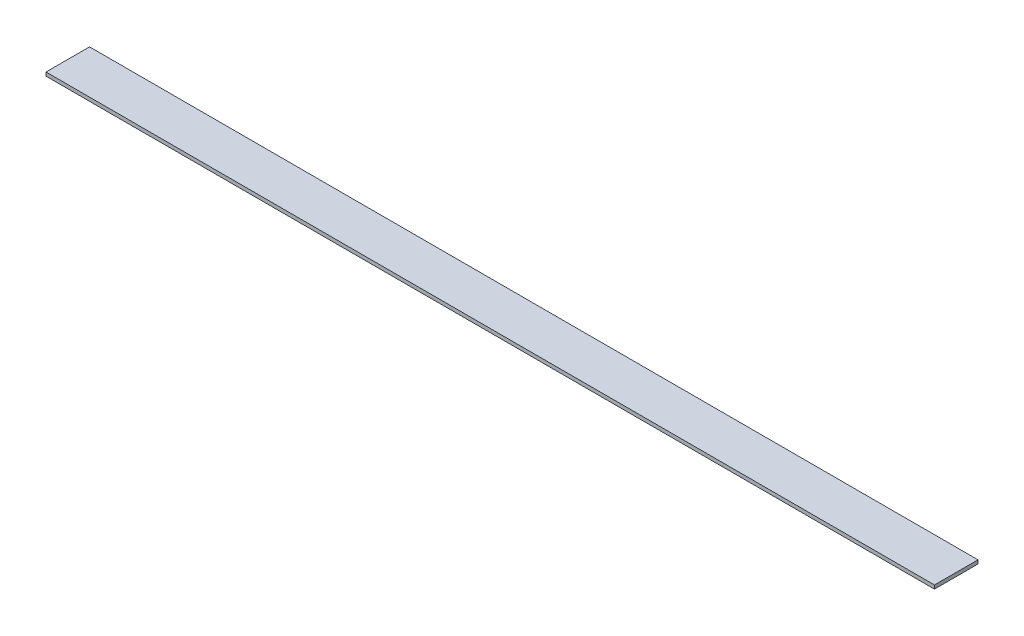
ISO-10303-21;
HEADER;
FILE_DESCRIPTION(('STEP AP214'),'2;1');
FILE_NAME('part.step','',(''),(''),'','','');
FILE_SCHEMA(('AUTOMOTIVE_DESIGN { 1 0 10303 214 1 1 1 1 }'));
ENDSEC;
DATA;
#1=APPLICATION_CONTEXT('core data for automotive mechanical design processes');
#2=APPLICATION_PROTOCOL_DEFINITION('international standard','automotive_design',2000,#1);
#3=PRODUCT_CONTEXT('',#1,'mechanical');
#4=PRODUCT('Part','Part','',(#3));
#5=PRODUCT_RELATED_PRODUCT_CATEGORY('part','',(#4));
#6=PRODUCT_DEFINITION_FORMATION('','',#4);
#7=PRODUCT_DEFINITION_CONTEXT('part definition',#1,'design');
#8=PRODUCT_DEFINITION('design','',#6,#7);
#9=PRODUCT_DEFINITION_SHAPE('','',#8);
#10=(LENGTH_UNIT() NAMED_UNIT(*) SI_UNIT(.MILLI.,.METRE.));
#11=(NAMED_UNIT(*) PLANE_ANGLE_UNIT() SI_UNIT($,.RADIAN.));
#12=(NAMED_UNIT(*) SI_UNIT($,.STERADIAN.) SOLID_ANGLE_UNIT());
#13=UNCERTAINTY_MEASURE_WITH_UNIT(LENGTH_MEASURE(1.E-05),#10,'distance_accuracy_value','');
#14=(GEOMETRIC_REPRESENTATION_CONTEXT(3) GLOBAL_UNCERTAINTY_ASSIGNED_CONTEXT((#13)) GLOBAL_UNIT_ASSIGNED_CONTEXT((#10,
#11,#12)) REPRESENTATION_CONTEXT('',''));
#15=CARTESIAN_POINT('',(0.,0.,0.));
#16=DIRECTION('',(0.,0.,1.));
#17=DIRECTION('',(1.,0.,0.));
#18=AXIS2_PLACEMENT_3D('',#15,#16,#17);
#19=CARTESIAN_POINT('',(0.,3.175,0.));
#20=DIRECTION('',(0.,-1.,0.));
#21=DIRECTION('',(0.,0.,-1.));
#22=AXIS2_PLACEMENT_3D('',#19,#20,#21);
#23=PLANE('',#22);
#24=DIRECTION('',(-1.,0.,0.));
#25=VECTOR('',#24,1.);
#26=CARTESIAN_POINT('',(465.,3.175,-277.5));
#27=LINE('',#26,#25);
#28=CARTESIAN_POINT('',(388.8,3.175,-277.5));
#29=VERTEX_POINT('',#28);
#30=CARTESIAN_POINT('',(-388.8,3.175,-277.5));
#31=VERTEX_POINT('',#30);
#32=EDGE_CURVE('E11',#29,#31,#27,.T.);
#33=ORIENTED_EDGE('',*,*,#32,.T.);
#34=DIRECTION('',(0.,0.,1.));
#35=VECTOR('',#34,1.);
#36=CARTESIAN_POINT('',(-388.8,3.175,1.67016719665026E-13));
#37=LINE('',#36,#35);
#38=CARTESIAN_POINT('',(-388.8,3.175,-239.4));
#39=VERTEX_POINT('',#38);
#40=EDGE_CURVE('E109',#31,#39,#37,.T.);
#41=ORIENTED_EDGE('',*,*,#40,.T.);
#42=DIRECTION('',(-1.,0.,0.));
#43=VECTOR('',#42,1.);
#44=CARTESIAN_POINT('',(388.8,3.175,-239.4));
#45=LINE('',#44,#43);
#46=CARTESIAN_POINT('',(388.8,3.175,-239.4));
#47=VERTEX_POINT('',#46);
#48=EDGE_CURVE('E103',#47,#39,#45,.T.);
#49=ORIENTED_EDGE('',*,*,#48,.F.);
#50=DIRECTION('',(0.,0.,-1.));
#51=VECTOR('',#50,1.);
#52=CARTESIAN_POINT('',(388.8,3.175,0.));
#53=LINE('',#52,#51);
#54=EDGE_CURVE('E55',#47,#29,#53,.T.);
#55=ORIENTED_EDGE('',*,*,#54,.T.);
#56=EDGE_LOOP('',(#33,#41,#49,#55));
#57=FACE_BOUND('',#56,.T.);
#58=ADVANCED_FACE('F39',(#57),#23,.F.);
#59=CARTESIAN_POINT('',(0.,0.,0.));
#60=DIRECTION('',(0.,-1.,0.));
#61=DIRECTION('',(0.,0.,-1.));
#62=AXIS2_PLACEMENT_3D('',#59,#60,#61);
#63=PLANE('',#62);
#64=DIRECTION('',(0.,0.,-1.));
#65=VECTOR('',#64,1.);
#66=CARTESIAN_POINT('',(-388.8,0.,-277.5));
#67=LINE('',#66,#65);
#68=CARTESIAN_POINT('',(-388.8,0.,-239.4));
#69=VERTEX_POINT('',#68);
#70=CARTESIAN_POINT('',(-388.8,0.,-277.5));
#71=VERTEX_POINT('',#70);
#72=EDGE_CURVE('E63',#69,#71,#67,.T.);
#73=ORIENTED_EDGE('',*,*,#72,.T.);
#74=DIRECTION('',(-1.,0.,0.));
#75=VECTOR('',#74,1.);
#76=CARTESIAN_POINT('',(465.,0.,-277.5));
#77=LINE('',#76,#75);
#78=CARTESIAN_POINT('',(388.8,0.,-277.5));
#79=VERTEX_POINT('',#78);
#80=EDGE_CURVE('E43',#79,#71,#77,.T.);
#81=ORIENTED_EDGE('',*,*,#80,.F.);
#82=DIRECTION('',(0.,0.,1.));
#83=VECTOR('',#82,1.);
#84=CARTESIAN_POINT('',(388.8,0.,-277.5));
#85=LINE('',#84,#83);
#86=CARTESIAN_POINT('',(388.8,0.,-239.4));
#87=VERTEX_POINT('',#86);
#88=EDGE_CURVE('E79',#79,#87,#85,.T.);
#89=ORIENTED_EDGE('',*,*,#88,.T.);
#90=DIRECTION('',(-1.,0.,0.));
#91=VECTOR('',#90,1.);
#92=CARTESIAN_POINT('',(388.8,0.,-239.4));
#93=LINE('',#92,#91);
#94=EDGE_CURVE('E106',#87,#69,#93,.T.);
#95=ORIENTED_EDGE('',*,*,#94,.T.);
#96=EDGE_LOOP('',(#73,#81,#89,#95));
#97=FACE_BOUND('',#96,.T.);
#98=ADVANCED_FACE('F97',(#97),#63,.T.);
#99=CARTESIAN_POINT('',(465.,3.175,-277.5));
#100=DIRECTION('',(0.,0.,1.));
#101=DIRECTION('',(1.,0.,0.));
#102=AXIS2_PLACEMENT_3D('',#99,#100,#101);
#103=PLANE('',#102);
#104=ORIENTED_EDGE('',*,*,#80,.T.);
#105=DIRECTION('',(0.,1.,0.));
#106=VECTOR('',#105,1.);
#107=CARTESIAN_POINT('',(-388.8,0.,-277.5));
#108=LINE('',#107,#106);
#109=EDGE_CURVE('E95',#71,#31,#108,.T.);
#110=ORIENTED_EDGE('',*,*,#109,.T.);
#111=ORIENTED_EDGE('',*,*,#32,.F.);
#112=DIRECTION('',(0.,1.,0.));
#113=VECTOR('',#112,1.);
#114=CARTESIAN_POINT('',(388.8,0.,-277.5));
#115=LINE('',#114,#113);
#116=EDGE_CURVE('E82',#79,#29,#115,.T.);
#117=ORIENTED_EDGE('',*,*,#116,.F.);
#118=EDGE_LOOP('',(#104,#110,#111,#117));
#119=FACE_BOUND('',#118,.T.);
#120=ADVANCED_FACE('F41',(#119),#103,.F.);
#121=CARTESIAN_POINT('',(388.8,3.175,-239.4));
#122=DIRECTION('',(0.,0.,1.));
#123=DIRECTION('',(1.,0.,0.));
#124=AXIS2_PLACEMENT_3D('',#121,#122,#123);
#125=PLANE('',#124);
#126=ORIENTED_EDGE('',*,*,#94,.F.);
#127=DIRECTION('',(0.,-1.,0.));
#128=VECTOR('',#127,1.);
#129=CARTESIAN_POINT('',(388.8,3.175,-239.4));
#130=LINE('',#129,#128);
#131=EDGE_CURVE('E83',#47,#87,#130,.T.);
#132=ORIENTED_EDGE('',*,*,#131,.F.);
#133=ORIENTED_EDGE('',*,*,#48,.T.);
#134=DIRECTION('',(0.,-1.,0.));
#135=VECTOR('',#134,1.);
#136=CARTESIAN_POINT('',(-388.8,3.175,-239.4));
#137=LINE('',#136,#135);
#138=EDGE_CURVE('E100',#39,#69,#137,.T.);
#139=ORIENTED_EDGE('',*,*,#138,.T.);
#140=EDGE_LOOP('',(#126,#132,#133,#139));
#141=FACE_BOUND('',#140,.T.);
#142=ADVANCED_FACE('F124',(#141),#125,.T.);
#143=CARTESIAN_POINT('',(388.8,0.,-277.5));
#144=DIRECTION('',(-1.,0.,0.));
#145=DIRECTION('',(0.,0.,1.));
#146=AXIS2_PLACEMENT_3D('',#143,#144,#145);
#147=PLANE('',#146);
#148=ORIENTED_EDGE('',*,*,#131,.T.);
#149=ORIENTED_EDGE('',*,*,#88,.F.);
#150=ORIENTED_EDGE('',*,*,#116,.T.);
#151=ORIENTED_EDGE('',*,*,#54,.F.);
#152=EDGE_LOOP('',(#148,#149,#150,#151));
#153=FACE_BOUND('',#152,.T.);
#154=ADVANCED_FACE('F81',(#153),#147,.F.);
#155=CARTESIAN_POINT('',(-388.8,0.,-277.5));
#156=DIRECTION('',(1.,0.,0.));
#157=DIRECTION('',(0.,0.,-1.));
#158=AXIS2_PLACEMENT_3D('',#155,#156,#157);
#159=PLANE('',#158);
#160=ORIENTED_EDGE('',*,*,#109,.F.);
#161=ORIENTED_EDGE('',*,*,#72,.F.);
#162=ORIENTED_EDGE('',*,*,#138,.F.);
#163=ORIENTED_EDGE('',*,*,#40,.F.);
#164=EDGE_LOOP('',(#160,#161,#162,#163));
#165=FACE_BOUND('',#164,.T.);
#166=ADVANCED_FACE('F125',(#165),#159,.F.);
#167=CLOSED_SHELL('',(#58,#98,#120,#142,#154,#166));
#168=MANIFOLD_SOLID_BREP('B2',#167);
#169=ADVANCED_BREP_SHAPE_REPRESENTATION('',(#18,#168),#14);
#170=SHAPE_DEFINITION_REPRESENTATION(#9,#169);
ENDSEC;
END-ISO-10303-21;
